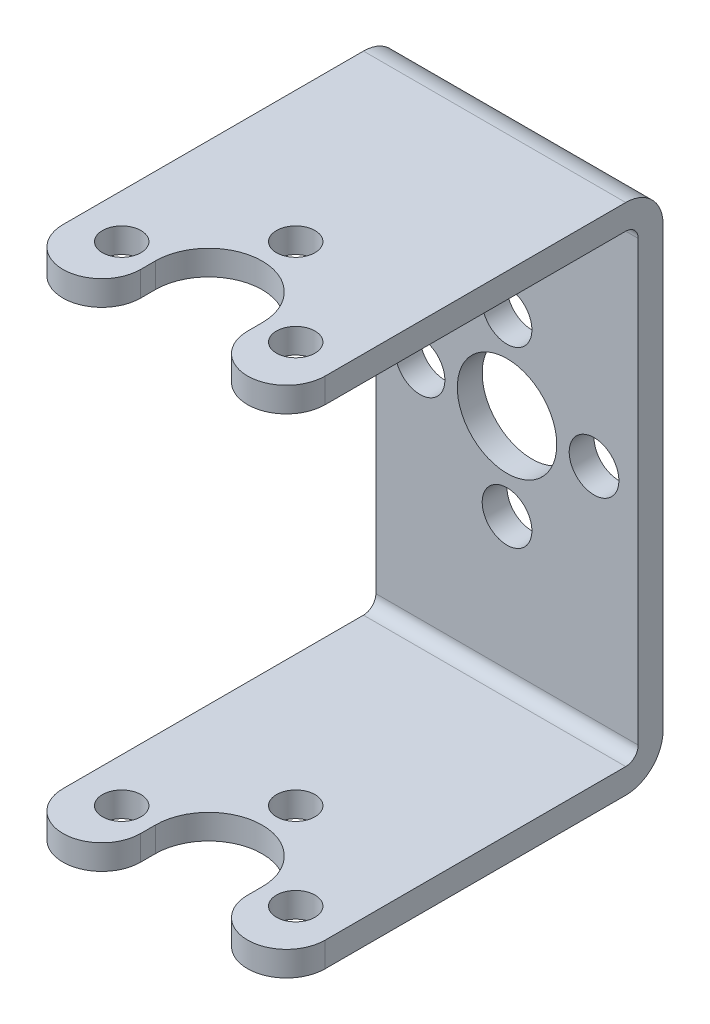
ISO-10303-21;
HEADER;
FILE_DESCRIPTION(('STEP AP214'),'2;1');
FILE_NAME('part.step','',(''),(''),'','','');
FILE_SCHEMA(('AUTOMOTIVE_DESIGN { 1 0 10303 214 1 1 1 1 }'));
ENDSEC;
DATA;
#1=APPLICATION_CONTEXT('core data for automotive mechanical design processes');
#2=APPLICATION_PROTOCOL_DEFINITION('international standard','automotive_design',2000,#1);
#3=PRODUCT_CONTEXT('',#1,'mechanical');
#4=PRODUCT('Part','Part','',(#3));
#5=PRODUCT_RELATED_PRODUCT_CATEGORY('part','',(#4));
#6=PRODUCT_DEFINITION_FORMATION('','',#4);
#7=PRODUCT_DEFINITION_CONTEXT('part definition',#1,'design');
#8=PRODUCT_DEFINITION('design','',#6,#7);
#9=PRODUCT_DEFINITION_SHAPE('','',#8);
#10=(LENGTH_UNIT() NAMED_UNIT(*) SI_UNIT(.MILLI.,.METRE.));
#11=(NAMED_UNIT(*) PLANE_ANGLE_UNIT() SI_UNIT($,.RADIAN.));
#12=(NAMED_UNIT(*) SI_UNIT($,.STERADIAN.) SOLID_ANGLE_UNIT());
#13=UNCERTAINTY_MEASURE_WITH_UNIT(LENGTH_MEASURE(1.E-05),#10,'distance_accuracy_value','');
#14=(GEOMETRIC_REPRESENTATION_CONTEXT(3) GLOBAL_UNCERTAINTY_ASSIGNED_CONTEXT((#13)) GLOBAL_UNIT_ASSIGNED_CONTEXT((#10,
#11,#12)) REPRESENTATION_CONTEXT('',''));
#15=CARTESIAN_POINT('',(0.,0.,0.));
#16=DIRECTION('',(0.,0.,1.));
#17=DIRECTION('',(1.,0.,0.));
#18=AXIS2_PLACEMENT_3D('',#15,#16,#17);
#19=CARTESIAN_POINT('',(0.,20.65,19.));
#20=DIRECTION('',(0.,1.,0.));
#21=DIRECTION('',(-1.,0.,0.));
#22=AXIS2_PLACEMENT_3D('',#19,#20,#21);
#23=CYLINDRICAL_SURFACE('',#22,1.55);
#24=CARTESIAN_POINT('',(0.,-20.65,19.));
#25=DIRECTION('',(0.,1.,0.));
#26=DIRECTION('',(-1.,0.,0.));
#27=AXIS2_PLACEMENT_3D('',#24,#25,#26);
#28=CIRCLE('',#27,1.55);
#29=CARTESIAN_POINT('',(-1.55,-20.65,19.));
#30=VERTEX_POINT('',#29);
#31=EDGE_CURVE('E285',#30,#30,#28,.T.);
#32=ORIENTED_EDGE('',*,*,#31,.F.);
#33=EDGE_LOOP('',(#32));
#34=FACE_BOUND('',#33,.T.);
#35=CARTESIAN_POINT('',(0.,-18.65,19.));
#36=DIRECTION('',(0.,1.,0.));
#37=DIRECTION('',(-1.,0.,0.));
#38=AXIS2_PLACEMENT_3D('',#35,#36,#37);
#39=CIRCLE('',#38,1.55);
#40=CARTESIAN_POINT('',(-1.55,-18.65,19.));
#41=VERTEX_POINT('',#40);
#42=EDGE_CURVE('E300',#41,#41,#39,.T.);
#43=ORIENTED_EDGE('',*,*,#42,.T.);
#44=EDGE_LOOP('',(#43));
#45=FACE_BOUND('',#44,.T.);
#46=ADVANCED_FACE('F43',(#34,#45),#23,.F.);
#47=CARTESIAN_POINT('',(7.,20.65,26.));
#48=DIRECTION('',(0.,1.,0.));
#49=DIRECTION('',(-1.,0.,0.));
#50=AXIS2_PLACEMENT_3D('',#47,#48,#49);
#51=CYLINDRICAL_SURFACE('',#50,1.55);
#52=CARTESIAN_POINT('',(7.,-20.65,26.));
#53=DIRECTION('',(0.,1.,0.));
#54=DIRECTION('',(-1.,0.,0.));
#55=AXIS2_PLACEMENT_3D('',#52,#53,#54);
#56=CIRCLE('',#55,1.55);
#57=CARTESIAN_POINT('',(5.45,-20.65,26.));
#58=VERTEX_POINT('',#57);
#59=EDGE_CURVE('E279',#58,#58,#56,.T.);
#60=ORIENTED_EDGE('',*,*,#59,.F.);
#61=EDGE_LOOP('',(#60));
#62=FACE_BOUND('',#61,.T.);
#63=CARTESIAN_POINT('',(7.,-18.65,26.));
#64=DIRECTION('',(0.,1.,0.));
#65=DIRECTION('',(-1.,0.,0.));
#66=AXIS2_PLACEMENT_3D('',#63,#64,#65);
#67=CIRCLE('',#66,1.55);
#68=CARTESIAN_POINT('',(5.45,-18.65,26.));
#69=VERTEX_POINT('',#68);
#70=EDGE_CURVE('E181',#69,#69,#67,.T.);
#71=ORIENTED_EDGE('',*,*,#70,.T.);
#72=EDGE_LOOP('',(#71));
#73=FACE_BOUND('',#72,.T.);
#74=ADVANCED_FACE('F575',(#62,#73),#51,.F.);
#75=CARTESIAN_POINT('',(-7.,20.65,26.));
#76=DIRECTION('',(0.,1.,0.));
#77=DIRECTION('',(-1.,0.,0.));
#78=AXIS2_PLACEMENT_3D('',#75,#76,#77);
#79=CYLINDRICAL_SURFACE('',#78,1.55);
#80=CARTESIAN_POINT('',(-7.,-20.65,26.));
#81=DIRECTION('',(0.,1.,0.));
#82=DIRECTION('',(-1.,0.,0.));
#83=AXIS2_PLACEMENT_3D('',#80,#81,#82);
#84=CIRCLE('',#83,1.55);
#85=CARTESIAN_POINT('',(-8.55,-20.65,26.));
#86=VERTEX_POINT('',#85);
#87=EDGE_CURVE('E273',#86,#86,#84,.T.);
#88=ORIENTED_EDGE('',*,*,#87,.F.);
#89=EDGE_LOOP('',(#88));
#90=FACE_BOUND('',#89,.T.);
#91=CARTESIAN_POINT('',(-7.,-18.65,26.));
#92=DIRECTION('',(0.,1.,0.));
#93=DIRECTION('',(-1.,0.,0.));
#94=AXIS2_PLACEMENT_3D('',#91,#92,#93);
#95=CIRCLE('',#94,1.55);
#96=CARTESIAN_POINT('',(-8.55,-18.65,26.));
#97=VERTEX_POINT('',#96);
#98=EDGE_CURVE('E176',#97,#97,#95,.T.);
#99=ORIENTED_EDGE('',*,*,#98,.T.);
#100=EDGE_LOOP('',(#99));
#101=FACE_BOUND('',#100,.T.);
#102=ADVANCED_FACE('F580',(#90,#101),#79,.F.);
#103=CARTESIAN_POINT('',(-4.3,20.65,27.175));
#104=DIRECTION('',(1.,0.,0.));
#105=DIRECTION('',(0.,1.,0.));
#106=AXIS2_PLACEMENT_3D('',#103,#104,#105);
#107=PLANE('',#106);
#108=DIRECTION('',(0.,0.,-1.));
#109=VECTOR('',#108,1.);
#110=CARTESIAN_POINT('',(-4.3,-18.65,21.9125));
#111=LINE('',#110,#109);
#112=CARTESIAN_POINT('',(-4.3,-18.65,27.175));
#113=VERTEX_POINT('',#112);
#114=CARTESIAN_POINT('',(-4.3,-18.65,26.));
#115=VERTEX_POINT('',#114);
#116=EDGE_CURVE('E114',#113,#115,#111,.T.);
#117=ORIENTED_EDGE('',*,*,#116,.F.);
#118=DIRECTION('',(0.,-1.,0.));
#119=VECTOR('',#118,1.);
#120=CARTESIAN_POINT('',(-4.3,20.65,27.175));
#121=LINE('',#120,#119);
#122=CARTESIAN_POINT('',(-4.3,-20.65,27.175));
#123=VERTEX_POINT('',#122);
#124=EDGE_CURVE('E191',#113,#123,#121,.T.);
#125=ORIENTED_EDGE('',*,*,#124,.T.);
#126=DIRECTION('',(0.,0.,-1.));
#127=VECTOR('',#126,1.);
#128=CARTESIAN_POINT('',(-4.3,-20.65,21.9125));
#129=LINE('',#128,#127);
#130=CARTESIAN_POINT('',(-4.3,-20.65,26.));
#131=VERTEX_POINT('',#130);
#132=EDGE_CURVE('E183',#123,#131,#129,.T.);
#133=ORIENTED_EDGE('',*,*,#132,.T.);
#134=DIRECTION('',(0.,-1.,0.));
#135=VECTOR('',#134,1.);
#136=CARTESIAN_POINT('',(-4.3,20.65,26.));
#137=LINE('',#136,#135);
#138=EDGE_CURVE('E11',#115,#131,#137,.T.);
#139=ORIENTED_EDGE('',*,*,#138,.F.);
#140=EDGE_LOOP('',(#117,#125,#133,#139));
#141=FACE_BOUND('',#140,.T.);
#142=ADVANCED_FACE('F595',(#141),#107,.T.);
#143=CARTESIAN_POINT('',(0.,20.65,26.));
#144=DIRECTION('',(0.,1.,0.));
#145=DIRECTION('',(-1.,0.,0.));
#146=AXIS2_PLACEMENT_3D('',#143,#144,#145);
#147=CYLINDRICAL_SURFACE('',#146,4.3);
#148=ORIENTED_EDGE('',*,*,#138,.T.);
#149=CARTESIAN_POINT('',(0.,-20.65,26.));
#150=DIRECTION('',(0.,1.,0.));
#151=DIRECTION('',(-1.,0.,0.));
#152=AXIS2_PLACEMENT_3D('',#149,#150,#151);
#153=CIRCLE('',#152,4.3);
#154=CARTESIAN_POINT('',(4.29999999995,-20.65,26.000020787284));
#155=VERTEX_POINT('',#154);
#156=EDGE_CURVE('E188',#155,#131,#153,.T.);
#157=ORIENTED_EDGE('',*,*,#156,.F.);
#158=DIRECTION('',(0.,-1.,0.));
#159=VECTOR('',#158,1.);
#160=CARTESIAN_POINT('',(4.29999999995,20.65,26.000020787284));
#161=LINE('',#160,#159);
#162=CARTESIAN_POINT('',(4.29999999995,-18.65,26.000020787284));
#163=VERTEX_POINT('',#162);
#164=EDGE_CURVE('E55',#163,#155,#161,.T.);
#165=ORIENTED_EDGE('',*,*,#164,.F.);
#166=CARTESIAN_POINT('',(0.,-18.65,26.));
#167=DIRECTION('',(0.,1.,0.));
#168=DIRECTION('',(-1.,0.,0.));
#169=AXIS2_PLACEMENT_3D('',#166,#167,#168);
#170=CIRCLE('',#169,4.3);
#171=EDGE_CURVE('E173',#163,#115,#170,.T.);
#172=ORIENTED_EDGE('',*,*,#171,.T.);
#173=EDGE_LOOP('',(#148,#157,#165,#172));
#174=FACE_BOUND('',#173,.T.);
#175=ADVANCED_FACE('F315',(#174),#147,.F.);
#176=CARTESIAN_POINT('',(4.29999999995,20.65,27.175));
#177=DIRECTION('',(1.,0.,0.));
#178=DIRECTION('',(0.,1.,0.));
#179=AXIS2_PLACEMENT_3D('',#176,#177,#178);
#180=PLANE('',#179);
#181=ORIENTED_EDGE('',*,*,#164,.T.);
#182=DIRECTION('',(0.,0.,-1.));
#183=VECTOR('',#182,1.);
#184=CARTESIAN_POINT('',(4.29999999995,-20.65,21.9125));
#185=LINE('',#184,#183);
#186=CARTESIAN_POINT('',(4.299999999975,-20.65,27.175));
#187=VERTEX_POINT('',#186);
#188=EDGE_CURVE('E270',#187,#155,#185,.T.);
#189=ORIENTED_EDGE('',*,*,#188,.F.);
#190=DIRECTION('',(0.,-1.,0.));
#191=VECTOR('',#190,1.);
#192=CARTESIAN_POINT('',(4.299999999975,20.65,27.175));
#193=LINE('',#192,#191);
#194=CARTESIAN_POINT('',(4.299999999975,-18.65,27.175));
#195=VERTEX_POINT('',#194);
#196=EDGE_CURVE('E62',#195,#187,#193,.T.);
#197=ORIENTED_EDGE('',*,*,#196,.F.);
#198=DIRECTION('',(0.,0.,-1.));
#199=VECTOR('',#198,1.);
#200=CARTESIAN_POINT('',(4.29999999995,-18.65,21.9125));
#201=LINE('',#200,#199);
#202=EDGE_CURVE('E292',#195,#163,#201,.T.);
#203=ORIENTED_EDGE('',*,*,#202,.T.);
#204=EDGE_LOOP('',(#181,#189,#197,#203));
#205=FACE_BOUND('',#204,.T.);
#206=ADVANCED_FACE('F303',(#205),#180,.F.);
#207=CARTESIAN_POINT('',(-7.,20.65,26.));
#208=DIRECTION('',(0.,1.,0.));
#209=DIRECTION('',(-1.,0.,0.));
#210=AXIS2_PLACEMENT_3D('',#207,#208,#209);
#211=CYLINDRICAL_SURFACE('',#210,1.55);
#212=CARTESIAN_POINT('',(-7.,18.65,26.));
#213=DIRECTION('',(0.,1.,0.));
#214=DIRECTION('',(-1.,0.,0.));
#215=AXIS2_PLACEMENT_3D('',#212,#213,#214);
#216=CIRCLE('',#215,1.55);
#217=CARTESIAN_POINT('',(-8.55,18.65,26.));
#218=VERTEX_POINT('',#217);
#219=EDGE_CURVE('E222',#218,#218,#216,.T.);
#220=ORIENTED_EDGE('',*,*,#219,.F.);
#221=EDGE_LOOP('',(#220));
#222=FACE_BOUND('',#221,.T.);
#223=CARTESIAN_POINT('',(-7.,20.65,26.));
#224=DIRECTION('',(0.,1.,0.));
#225=DIRECTION('',(-1.,0.,0.));
#226=AXIS2_PLACEMENT_3D('',#223,#224,#225);
#227=CIRCLE('',#226,1.55);
#228=CARTESIAN_POINT('',(-8.55,20.65,26.));
#229=VERTEX_POINT('',#228);
#230=EDGE_CURVE('E251',#229,#229,#227,.T.);
#231=ORIENTED_EDGE('',*,*,#230,.T.);
#232=EDGE_LOOP('',(#231));
#233=FACE_BOUND('',#232,.T.);
#234=ADVANCED_FACE('F607',(#222,#233),#211,.F.);
#235=CARTESIAN_POINT('',(7.,20.65,26.));
#236=DIRECTION('',(0.,1.,0.));
#237=DIRECTION('',(-1.,0.,0.));
#238=AXIS2_PLACEMENT_3D('',#235,#236,#237);
#239=CYLINDRICAL_SURFACE('',#238,1.55);
#240=CARTESIAN_POINT('',(7.,18.65,26.));
#241=DIRECTION('',(0.,1.,0.));
#242=DIRECTION('',(-1.,0.,0.));
#243=AXIS2_PLACEMENT_3D('',#240,#241,#242);
#244=CIRCLE('',#243,1.55);
#245=CARTESIAN_POINT('',(5.45,18.65,26.));
#246=VERTEX_POINT('',#245);
#247=EDGE_CURVE('E220',#246,#246,#244,.T.);
#248=ORIENTED_EDGE('',*,*,#247,.F.);
#249=EDGE_LOOP('',(#248));
#250=FACE_BOUND('',#249,.T.);
#251=CARTESIAN_POINT('',(7.,20.65,26.));
#252=DIRECTION('',(0.,1.,0.));
#253=DIRECTION('',(-1.,0.,0.));
#254=AXIS2_PLACEMENT_3D('',#251,#252,#253);
#255=CIRCLE('',#254,1.55);
#256=CARTESIAN_POINT('',(5.45,20.65,26.));
#257=VERTEX_POINT('',#256);
#258=EDGE_CURVE('E246',#257,#257,#255,.T.);
#259=ORIENTED_EDGE('',*,*,#258,.T.);
#260=EDGE_LOOP('',(#259));
#261=FACE_BOUND('',#260,.T.);
#262=ADVANCED_FACE('F606',(#250,#261),#239,.F.);
#263=CARTESIAN_POINT('',(0.,20.65,19.));
#264=DIRECTION('',(0.,1.,0.));
#265=DIRECTION('',(-1.,0.,0.));
#266=AXIS2_PLACEMENT_3D('',#263,#264,#265);
#267=CYLINDRICAL_SURFACE('',#266,1.55);
#268=CARTESIAN_POINT('',(0.,18.65,19.));
#269=DIRECTION('',(0.,1.,0.));
#270=DIRECTION('',(-1.,0.,0.));
#271=AXIS2_PLACEMENT_3D('',#268,#269,#270);
#272=CIRCLE('',#271,1.55);
#273=CARTESIAN_POINT('',(-1.55,18.65,19.));
#274=VERTEX_POINT('',#273);
#275=EDGE_CURVE('E213',#274,#274,#272,.T.);
#276=ORIENTED_EDGE('',*,*,#275,.F.);
#277=EDGE_LOOP('',(#276));
#278=FACE_BOUND('',#277,.T.);
#279=CARTESIAN_POINT('',(0.,20.65,19.));
#280=DIRECTION('',(0.,1.,0.));
#281=DIRECTION('',(-1.,0.,0.));
#282=AXIS2_PLACEMENT_3D('',#279,#280,#281);
#283=CIRCLE('',#282,1.55);
#284=CARTESIAN_POINT('',(-1.55,20.65,19.));
#285=VERTEX_POINT('',#284);
#286=EDGE_CURVE('E244',#285,#285,#283,.T.);
#287=ORIENTED_EDGE('',*,*,#286,.T.);
#288=EDGE_LOOP('',(#287));
#289=FACE_BOUND('',#288,.T.);
#290=ADVANCED_FACE('F612',(#278,#289),#267,.F.);
#291=CARTESIAN_POINT('',(-4.3,20.65,27.175));
#292=DIRECTION('',(1.,0.,0.));
#293=DIRECTION('',(0.,1.,0.));
#294=AXIS2_PLACEMENT_3D('',#291,#292,#293);
#295=PLANE('',#294);
#296=DIRECTION('',(0.,0.,-1.));
#297=VECTOR('',#296,1.);
#298=CARTESIAN_POINT('',(-4.3,20.65,27.175));
#299=LINE('',#298,#297);
#300=CARTESIAN_POINT('',(-4.3,20.65,27.175));
#301=VERTEX_POINT('',#300);
#302=CARTESIAN_POINT('',(-4.3,20.65,26.));
#303=VERTEX_POINT('',#302);
#304=EDGE_CURVE('E235',#301,#303,#299,.T.);
#305=ORIENTED_EDGE('',*,*,#304,.F.);
#306=DIRECTION('',(0.,-1.,0.));
#307=VECTOR('',#306,1.);
#308=CARTESIAN_POINT('',(-4.3,20.65,27.175));
#309=LINE('',#308,#307);
#310=CARTESIAN_POINT('',(-4.3,18.65,27.175));
#311=VERTEX_POINT('',#310);
#312=EDGE_CURVE('E223',#301,#311,#309,.T.);
#313=ORIENTED_EDGE('',*,*,#312,.T.);
#314=DIRECTION('',(0.,0.,-1.));
#315=VECTOR('',#314,1.);
#316=CARTESIAN_POINT('',(-4.3,18.65,21.9125));
#317=LINE('',#316,#315);
#318=CARTESIAN_POINT('',(-4.3,18.65,26.));
#319=VERTEX_POINT('',#318);
#320=EDGE_CURVE('E205',#311,#319,#317,.T.);
#321=ORIENTED_EDGE('',*,*,#320,.T.);
#322=DIRECTION('',(0.,-1.,0.));
#323=VECTOR('',#322,1.);
#324=CARTESIAN_POINT('',(-4.3,20.65,26.));
#325=LINE('',#324,#323);
#326=EDGE_CURVE('E202',#303,#319,#325,.T.);
#327=ORIENTED_EDGE('',*,*,#326,.F.);
#328=EDGE_LOOP('',(#305,#313,#321,#327));
#329=FACE_BOUND('',#328,.T.);
#330=ADVANCED_FACE('F619',(#329),#295,.T.);
#331=CARTESIAN_POINT('',(0.,20.65,26.));
#332=DIRECTION('',(0.,1.,0.));
#333=DIRECTION('',(-1.,0.,0.));
#334=AXIS2_PLACEMENT_3D('',#331,#332,#333);
#335=CYLINDRICAL_SURFACE('',#334,4.3);
#336=ORIENTED_EDGE('',*,*,#326,.T.);
#337=CARTESIAN_POINT('',(0.,18.65,26.));
#338=DIRECTION('',(0.,1.,0.));
#339=DIRECTION('',(-1.,0.,0.));
#340=AXIS2_PLACEMENT_3D('',#337,#338,#339);
#341=CIRCLE('',#340,4.3);
#342=CARTESIAN_POINT('',(4.29999999995,18.65,26.000020787284));
#343=VERTEX_POINT('',#342);
#344=EDGE_CURVE('E196',#343,#319,#341,.T.);
#345=ORIENTED_EDGE('',*,*,#344,.F.);
#346=DIRECTION('',(0.,-1.,0.));
#347=VECTOR('',#346,1.);
#348=CARTESIAN_POINT('',(4.29999999995,20.65,26.000020787284));
#349=LINE('',#348,#347);
#350=CARTESIAN_POINT('',(4.29999999995,20.65,26.000020787284));
#351=VERTEX_POINT('',#350);
#352=EDGE_CURVE('E180',#351,#343,#349,.T.);
#353=ORIENTED_EDGE('',*,*,#352,.F.);
#354=CARTESIAN_POINT('',(0.,20.65,26.));
#355=DIRECTION('',(0.,1.,0.));
#356=DIRECTION('',(-1.,0.,0.));
#357=AXIS2_PLACEMENT_3D('',#354,#355,#356);
#358=CIRCLE('',#357,4.3);
#359=EDGE_CURVE('E240',#351,#303,#358,.T.);
#360=ORIENTED_EDGE('',*,*,#359,.T.);
#361=EDGE_LOOP('',(#336,#345,#353,#360));
#362=FACE_BOUND('',#361,.T.);
#363=ADVANCED_FACE('F622',(#362),#335,.F.);
#364=CARTESIAN_POINT('',(4.29999999995,20.65,27.175));
#365=DIRECTION('',(1.,0.,0.));
#366=DIRECTION('',(0.,1.,0.));
#367=AXIS2_PLACEMENT_3D('',#364,#365,#366);
#368=PLANE('',#367);
#369=ORIENTED_EDGE('',*,*,#352,.T.);
#370=DIRECTION('',(0.,0.,-1.));
#371=VECTOR('',#370,1.);
#372=CARTESIAN_POINT('',(4.29999999995,18.65,21.9125));
#373=LINE('',#372,#371);
#374=CARTESIAN_POINT('',(4.299999999975,18.65,27.175));
#375=VERTEX_POINT('',#374);
#376=EDGE_CURVE('E141',#375,#343,#373,.T.);
#377=ORIENTED_EDGE('',*,*,#376,.F.);
#378=DIRECTION('',(0.,-1.,0.));
#379=VECTOR('',#378,1.);
#380=CARTESIAN_POINT('',(4.299999999975,20.65,27.175));
#381=LINE('',#380,#379);
#382=CARTESIAN_POINT('',(4.299999999975,20.65,27.175));
#383=VERTEX_POINT('',#382);
#384=EDGE_CURVE('E140',#383,#375,#381,.T.);
#385=ORIENTED_EDGE('',*,*,#384,.F.);
#386=DIRECTION('',(0.,0.,-1.));
#387=VECTOR('',#386,1.);
#388=CARTESIAN_POINT('',(4.29999999995,20.65,27.175));
#389=LINE('',#388,#387);
#390=EDGE_CURVE('E236',#383,#351,#389,.T.);
#391=ORIENTED_EDGE('',*,*,#390,.T.);
#392=EDGE_LOOP('',(#369,#377,#385,#391));
#393=FACE_BOUND('',#392,.T.);
#394=ADVANCED_FACE('F623',(#393),#368,.F.);
#395=CARTESIAN_POINT('',(7.425,20.65,27.175));
#396=DIRECTION('',(0.,1.,0.));
#397=DIRECTION('',(-1.,0.,0.));
#398=AXIS2_PLACEMENT_3D('',#395,#396,#397);
#399=CYLINDRICAL_SURFACE('',#398,3.125);
#400=ORIENTED_EDGE('',*,*,#384,.T.);
#401=CARTESIAN_POINT('',(7.425,18.65,27.175));
#402=DIRECTION('',(0.,1.,0.));
#403=DIRECTION('',(-1.,0.,0.));
#404=AXIS2_PLACEMENT_3D('',#401,#402,#403);
#405=CIRCLE('',#404,3.125);
#406=CARTESIAN_POINT('',(10.55,18.65,27.175));
#407=VERTEX_POINT('',#406);
#408=EDGE_CURVE('E131',#375,#407,#405,.T.);
#409=ORIENTED_EDGE('',*,*,#408,.T.);
#410=DIRECTION('',(0.,-1.,0.));
#411=VECTOR('',#410,1.);
#412=CARTESIAN_POINT('',(10.55,20.65,27.175));
#413=LINE('',#412,#411);
#414=CARTESIAN_POINT('',(10.55,20.65,27.175));
#415=VERTEX_POINT('',#414);
#416=EDGE_CURVE('E137',#415,#407,#413,.T.);
#417=ORIENTED_EDGE('',*,*,#416,.F.);
#418=CARTESIAN_POINT('',(7.425,20.65,27.175));
#419=DIRECTION('',(0.,1.,0.));
#420=DIRECTION('',(-1.,0.,0.));
#421=AXIS2_PLACEMENT_3D('',#418,#419,#420);
#422=CIRCLE('',#421,3.125);
#423=EDGE_CURVE('E245',#383,#415,#422,.T.);
#424=ORIENTED_EDGE('',*,*,#423,.F.);
#425=EDGE_LOOP('',(#400,#409,#417,#424));
#426=FACE_BOUND('',#425,.T.);
#427=ADVANCED_FACE('F132',(#426),#399,.T.);
#428=CARTESIAN_POINT('',(7.425,20.65,27.175));
#429=DIRECTION('',(0.,1.,0.));
#430=DIRECTION('',(-1.,0.,0.));
#431=AXIS2_PLACEMENT_3D('',#428,#429,#430);
#432=CYLINDRICAL_SURFACE('',#431,3.125);
#433=ORIENTED_EDGE('',*,*,#196,.T.);
#434=CARTESIAN_POINT('',(7.425,-20.65,27.175));
#435=DIRECTION('',(0.,1.,0.));
#436=DIRECTION('',(-1.,0.,0.));
#437=AXIS2_PLACEMENT_3D('',#434,#435,#436);
#438=CIRCLE('',#437,3.125);
#439=CARTESIAN_POINT('',(10.55,-20.65,27.175));
#440=VERTEX_POINT('',#439);
#441=EDGE_CURVE('E263',#187,#440,#438,.T.);
#442=ORIENTED_EDGE('',*,*,#441,.T.);
#443=DIRECTION('',(0.,-1.,0.));
#444=VECTOR('',#443,1.);
#445=CARTESIAN_POINT('',(10.55,20.65,27.175));
#446=LINE('',#445,#444);
#447=CARTESIAN_POINT('',(10.55,-18.65,27.175));
#448=VERTEX_POINT('',#447);
#449=EDGE_CURVE('E394',#448,#440,#446,.T.);
#450=ORIENTED_EDGE('',*,*,#449,.F.);
#451=CARTESIAN_POINT('',(7.425,-18.65,27.175));
#452=DIRECTION('',(0.,1.,0.));
#453=DIRECTION('',(-1.,0.,0.));
#454=AXIS2_PLACEMENT_3D('',#451,#452,#453);
#455=CIRCLE('',#454,3.125);
#456=EDGE_CURVE('E184',#195,#448,#455,.T.);
#457=ORIENTED_EDGE('',*,*,#456,.F.);
#458=EDGE_LOOP('',(#433,#442,#450,#457));
#459=FACE_BOUND('',#458,.T.);
#460=ADVANCED_FACE('F551',(#459),#432,.T.);
#461=CARTESIAN_POINT('',(0.,-18.65,16.65));
#462=DIRECTION('',(0.,1.,0.));
#463=DIRECTION('',(0.,0.,-1.));
#464=AXIS2_PLACEMENT_3D('',#461,#462,#463);
#465=PLANE('',#464);
#466=ORIENTED_EDGE('',*,*,#42,.F.);
#467=EDGE_LOOP('',(#466));
#468=FACE_BOUND('',#467,.T.);
#469=ORIENTED_EDGE('',*,*,#70,.F.);
#470=EDGE_LOOP('',(#469));
#471=FACE_BOUND('',#470,.T.);
#472=ORIENTED_EDGE('',*,*,#98,.F.);
#473=EDGE_LOOP('',(#472));
#474=FACE_BOUND('',#473,.T.);
#475=DIRECTION('',(1.,0.,0.));
#476=VECTOR('',#475,1.);
#477=CARTESIAN_POINT('',(-10.55,-18.65,3.));
#478=LINE('',#477,#476);
#479=CARTESIAN_POINT('',(-10.55,-18.65,3.));
#480=VERTEX_POINT('',#479);
#481=CARTESIAN_POINT('',(10.55,-18.65,3.));
#482=VERTEX_POINT('',#481);
#483=EDGE_CURVE('E381',#480,#482,#478,.T.);
#484=ORIENTED_EDGE('',*,*,#483,.F.);
#485=DIRECTION('',(0.,0.,1.));
#486=VECTOR('',#485,1.);
#487=CARTESIAN_POINT('',(-10.55,-18.65,3.));
#488=LINE('',#487,#486);
#489=CARTESIAN_POINT('',(-10.55,-18.65,27.175));
#490=VERTEX_POINT('',#489);
#491=EDGE_CURVE('E376',#480,#490,#488,.T.);
#492=ORIENTED_EDGE('',*,*,#491,.T.);
#493=CARTESIAN_POINT('',(-7.425,-18.65,27.175));
#494=DIRECTION('',(0.,1.,0.));
#495=DIRECTION('',(-1.,0.,0.));
#496=AXIS2_PLACEMENT_3D('',#493,#494,#495);
#497=CIRCLE('',#496,3.125);
#498=EDGE_CURVE('E174',#490,#113,#497,.T.);
#499=ORIENTED_EDGE('',*,*,#498,.T.);
#500=ORIENTED_EDGE('',*,*,#116,.T.);
#501=ORIENTED_EDGE('',*,*,#171,.F.);
#502=ORIENTED_EDGE('',*,*,#202,.F.);
#503=ORIENTED_EDGE('',*,*,#456,.T.);
#504=DIRECTION('',(0.,0.,-1.));
#505=VECTOR('',#504,1.);
#506=CARTESIAN_POINT('',(10.55,-18.65,30.3));
#507=LINE('',#506,#505);
#508=EDGE_CURVE('E393',#448,#482,#507,.T.);
#509=ORIENTED_EDGE('',*,*,#508,.T.);
#510=EDGE_LOOP('',(#484,#492,#499,#500,#501,#502,#503,#509));
#511=FACE_BOUND('',#510,.T.);
#512=ADVANCED_FACE('F552',(#468,#471,#474,#511),#465,.T.);
#513=CARTESIAN_POINT('',(-7.425,20.65,27.175));
#514=DIRECTION('',(0.,1.,0.));
#515=DIRECTION('',(-1.,0.,0.));
#516=AXIS2_PLACEMENT_3D('',#513,#514,#515);
#517=CYLINDRICAL_SURFACE('',#516,3.125);
#518=CARTESIAN_POINT('',(-7.425,-20.65,27.175));
#519=DIRECTION('',(0.,1.,0.));
#520=DIRECTION('',(-1.,0.,0.));
#521=AXIS2_PLACEMENT_3D('',#518,#519,#520);
#522=CIRCLE('',#521,3.125);
#523=CARTESIAN_POINT('',(-10.55,-20.65,27.175));
#524=VERTEX_POINT('',#523);
#525=EDGE_CURVE('E187',#524,#123,#522,.T.);
#526=ORIENTED_EDGE('',*,*,#525,.T.);
#527=ORIENTED_EDGE('',*,*,#124,.F.);
#528=ORIENTED_EDGE('',*,*,#498,.F.);
#529=DIRECTION('',(0.,-1.,0.));
#530=VECTOR('',#529,1.);
#531=CARTESIAN_POINT('',(-10.55,20.65,27.175));
#532=LINE('',#531,#530);
#533=EDGE_CURVE('E375',#490,#524,#532,.T.);
#534=ORIENTED_EDGE('',*,*,#533,.T.);
#535=EDGE_LOOP('',(#526,#527,#528,#534));
#536=FACE_BOUND('',#535,.T.);
#537=ADVANCED_FACE('F566',(#536),#517,.T.);
#538=CARTESIAN_POINT('',(0.,-20.65,16.65));
#539=DIRECTION('',(0.,1.,0.));
#540=DIRECTION('',(0.,0.,-1.));
#541=AXIS2_PLACEMENT_3D('',#538,#539,#540);
#542=PLANE('',#541);
#543=ORIENTED_EDGE('',*,*,#31,.T.);
#544=EDGE_LOOP('',(#543));
#545=FACE_BOUND('',#544,.T.);
#546=ORIENTED_EDGE('',*,*,#59,.T.);
#547=EDGE_LOOP('',(#546));
#548=FACE_BOUND('',#547,.T.);
#549=ORIENTED_EDGE('',*,*,#87,.T.);
#550=EDGE_LOOP('',(#549));
#551=FACE_BOUND('',#550,.T.);
#552=ORIENTED_EDGE('',*,*,#441,.F.);
#553=ORIENTED_EDGE('',*,*,#188,.T.);
#554=ORIENTED_EDGE('',*,*,#156,.T.);
#555=ORIENTED_EDGE('',*,*,#132,.F.);
#556=ORIENTED_EDGE('',*,*,#525,.F.);
#557=DIRECTION('',(0.,0.,1.));
#558=VECTOR('',#557,1.);
#559=CARTESIAN_POINT('',(-10.55,-20.65,3.));
#560=LINE('',#559,#558);
#561=CARTESIAN_POINT('',(-10.55,-20.65,3.));
#562=VERTEX_POINT('',#561);
#563=EDGE_CURVE('E364',#562,#524,#560,.T.);
#564=ORIENTED_EDGE('',*,*,#563,.F.);
#565=DIRECTION('',(-1.,0.,0.));
#566=VECTOR('',#565,1.);
#567=CARTESIAN_POINT('',(10.55,-20.65,3.));
#568=LINE('',#567,#566);
#569=CARTESIAN_POINT('',(10.55,-20.65,3.));
#570=VERTEX_POINT('',#569);
#571=EDGE_CURVE('E259',#570,#562,#568,.T.);
#572=ORIENTED_EDGE('',*,*,#571,.F.);
#573=DIRECTION('',(0.,0.,-1.));
#574=VECTOR('',#573,1.);
#575=CARTESIAN_POINT('',(10.55,-20.65,30.3));
#576=LINE('',#575,#574);
#577=EDGE_CURVE('E332',#440,#570,#576,.T.);
#578=ORIENTED_EDGE('',*,*,#577,.F.);
#579=EDGE_LOOP('',(#552,#553,#554,#555,#556,#564,#572,#578));
#580=FACE_BOUND('',#579,.T.);
#581=ADVANCED_FACE('F316',(#545,#548,#551,#580),#542,.F.);
#582=CARTESIAN_POINT('',(10.55,-17.65,3.));
#583=DIRECTION('',(-1.,0.,0.));
#584=DIRECTION('',(0.,0.,-1.));
#585=AXIS2_PLACEMENT_3D('',#582,#583,#584);
#586=CYLINDRICAL_SURFACE('',#585,3.);
#587=CARTESIAN_POINT('',(10.55,-17.65,3.));
#588=DIRECTION('',(-1.,0.,0.));
#589=DIRECTION('',(0.,0.,-1.));
#590=AXIS2_PLACEMENT_3D('',#587,#588,#589);
#591=CIRCLE('',#590,3.);
#592=CARTESIAN_POINT('',(10.55,-17.65,0.));
#593=VERTEX_POINT('',#592);
#594=EDGE_CURVE('E330',#593,#570,#591,.T.);
#595=ORIENTED_EDGE('',*,*,#594,.T.);
#596=ORIENTED_EDGE('',*,*,#571,.T.);
#597=CARTESIAN_POINT('',(-10.55,-17.65,3.));
#598=DIRECTION('',(-1.,0.,0.));
#599=DIRECTION('',(0.,0.,-1.));
#600=AXIS2_PLACEMENT_3D('',#597,#598,#599);
#601=CIRCLE('',#600,3.);
#602=CARTESIAN_POINT('',(-10.55,-17.65,0.));
#603=VERTEX_POINT('',#602);
#604=EDGE_CURVE('E363',#603,#562,#601,.T.);
#605=ORIENTED_EDGE('',*,*,#604,.F.);
#606=DIRECTION('',(1.,0.,0.));
#607=VECTOR('',#606,1.);
#608=CARTESIAN_POINT('',(-10.55,-17.65,0.));
#609=LINE('',#608,#607);
#610=EDGE_CURVE('E256',#603,#593,#609,.T.);
#611=ORIENTED_EDGE('',*,*,#610,.T.);
#612=EDGE_LOOP('',(#595,#596,#605,#611));
#613=FACE_BOUND('',#612,.T.);
#614=ADVANCED_FACE('F556',(#613),#586,.T.);
#615=CARTESIAN_POINT('',(-10.55,-17.65,0.));
#616=DIRECTION('',(0.,0.,1.));
#617=DIRECTION('',(1.,0.,0.));
#618=AXIS2_PLACEMENT_3D('',#615,#616,#617);
#619=PLANE('',#618);
#620=CARTESIAN_POINT('',(0.,-7.,0.));
#621=DIRECTION('',(0.,0.,-1.));
#622=DIRECTION('',(-1.,0.,0.));
#623=AXIS2_PLACEMENT_3D('',#620,#621,#622);
#624=CIRCLE('',#623,2.);
#625=CARTESIAN_POINT('',(-2.,-7.,0.));
#626=VERTEX_POINT('',#625);
#627=EDGE_CURVE('E534',#626,#626,#624,.T.);
#628=ORIENTED_EDGE('',*,*,#627,.F.);
#629=EDGE_LOOP('',(#628));
#630=FACE_BOUND('',#629,.T.);
#631=CARTESIAN_POINT('',(7.,0.,0.));
#632=DIRECTION('',(0.,0.,-1.));
#633=DIRECTION('',(-1.,0.,0.));
#634=AXIS2_PLACEMENT_3D('',#631,#632,#633);
#635=CIRCLE('',#634,2.);
#636=CARTESIAN_POINT('',(5.,0.,0.));
#637=VERTEX_POINT('',#636);
#638=EDGE_CURVE('E918',#637,#637,#635,.T.);
#639=ORIENTED_EDGE('',*,*,#638,.F.);
#640=EDGE_LOOP('',(#639));
#641=FACE_BOUND('',#640,.T.);
#642=CARTESIAN_POINT('',(0.,7.,0.));
#643=DIRECTION('',(0.,0.,-1.));
#644=DIRECTION('',(-1.,0.,0.));
#645=AXIS2_PLACEMENT_3D('',#642,#643,#644);
#646=CIRCLE('',#645,2.);
#647=CARTESIAN_POINT('',(-2.00000000000005,7.,0.));
#648=VERTEX_POINT('',#647);
#649=EDGE_CURVE('E922',#648,#648,#646,.T.);
#650=ORIENTED_EDGE('',*,*,#649,.F.);
#651=EDGE_LOOP('',(#650));
#652=FACE_BOUND('',#651,.T.);
#653=CARTESIAN_POINT('',(-7.,0.,0.));
#654=DIRECTION('',(0.,0.,-1.));
#655=DIRECTION('',(-1.,0.,0.));
#656=AXIS2_PLACEMENT_3D('',#653,#654,#655);
#657=CIRCLE('',#656,2.);
#658=CARTESIAN_POINT('',(-9.,0.,0.));
#659=VERTEX_POINT('',#658);
#660=EDGE_CURVE('E929',#659,#659,#657,.T.);
#661=ORIENTED_EDGE('',*,*,#660,.F.);
#662=EDGE_LOOP('',(#661));
#663=FACE_BOUND('',#662,.T.);
#664=CARTESIAN_POINT('',(0.,0.,0.));
#665=DIRECTION('',(0.,0.,1.));
#666=DIRECTION('',(1.,0.,0.));
#667=AXIS2_PLACEMENT_3D('',#664,#665,#666);
#668=CIRCLE('',#667,4.);
#669=CARTESIAN_POINT('',(4.,0.,0.));
#670=VERTEX_POINT('',#669);
#671=EDGE_CURVE('E145',#670,#670,#668,.T.);
#672=ORIENTED_EDGE('',*,*,#671,.T.);
#673=EDGE_LOOP('',(#672));
#674=FACE_BOUND('',#673,.T.);
#675=DIRECTION('',(1.,0.,0.));
#676=VECTOR('',#675,1.);
#677=CARTESIAN_POINT('',(-10.55,17.65,0.));
#678=LINE('',#677,#676);
#679=CARTESIAN_POINT('',(-10.55,17.65,0.));
#680=VERTEX_POINT('',#679);
#681=CARTESIAN_POINT('',(10.55,17.65,0.));
#682=VERTEX_POINT('',#681);
#683=EDGE_CURVE('E255',#680,#682,#678,.T.);
#684=ORIENTED_EDGE('',*,*,#683,.T.);
#685=DIRECTION('',(0.,1.,0.));
#686=VECTOR('',#685,1.);
#687=CARTESIAN_POINT('',(10.55,-17.65,0.));
#688=LINE('',#687,#686);
#689=EDGE_CURVE('E329',#593,#682,#688,.T.);
#690=ORIENTED_EDGE('',*,*,#689,.F.);
#691=ORIENTED_EDGE('',*,*,#610,.F.);
#692=DIRECTION('',(0.,1.,0.));
#693=VECTOR('',#692,1.);
#694=CARTESIAN_POINT('',(-10.55,-17.65,0.));
#695=LINE('',#694,#693);
#696=EDGE_CURVE('E359',#603,#680,#695,.T.);
#697=ORIENTED_EDGE('',*,*,#696,.T.);
#698=EDGE_LOOP('',(#684,#690,#691,#697));
#699=FACE_BOUND('',#698,.T.);
#700=ADVANCED_FACE('F557',(#630,#641,#652,#663,#674,#699),#619,.F.);
#701=CARTESIAN_POINT('',(10.55,17.65,3.));
#702=DIRECTION('',(-1.,0.,0.));
#703=DIRECTION('',(0.,0.,-1.));
#704=AXIS2_PLACEMENT_3D('',#701,#702,#703);
#705=CYLINDRICAL_SURFACE('',#704,3.);
#706=ORIENTED_EDGE('',*,*,#683,.F.);
#707=CARTESIAN_POINT('',(-10.55,17.65,3.));
#708=DIRECTION('',(1.,0.,0.));
#709=DIRECTION('',(0.,0.,-1.));
#710=AXIS2_PLACEMENT_3D('',#707,#708,#709);
#711=CIRCLE('',#710,3.);
#712=CARTESIAN_POINT('',(-10.55,20.65,3.));
#713=VERTEX_POINT('',#712);
#714=EDGE_CURVE('E351',#680,#713,#711,.T.);
#715=ORIENTED_EDGE('',*,*,#714,.T.);
#716=DIRECTION('',(-1.,0.,0.));
#717=VECTOR('',#716,1.);
#718=CARTESIAN_POINT('',(10.55,20.65,3.));
#719=LINE('',#718,#717);
#720=CARTESIAN_POINT('',(10.55,20.65,3.));
#721=VERTEX_POINT('',#720);
#722=EDGE_CURVE('E228',#721,#713,#719,.T.);
#723=ORIENTED_EDGE('',*,*,#722,.F.);
#724=CARTESIAN_POINT('',(10.55,17.65,3.));
#725=DIRECTION('',(1.,0.,0.));
#726=DIRECTION('',(0.,0.,-1.));
#727=AXIS2_PLACEMENT_3D('',#724,#725,#726);
#728=CIRCLE('',#727,3.);
#729=EDGE_CURVE('E169',#682,#721,#728,.T.);
#730=ORIENTED_EDGE('',*,*,#729,.F.);
#731=EDGE_LOOP('',(#706,#715,#723,#730));
#732=FACE_BOUND('',#731,.T.);
#733=ADVANCED_FACE('F416',(#732),#705,.T.);
#734=CARTESIAN_POINT('',(0.,20.65,16.65));
#735=DIRECTION('',(0.,1.,0.));
#736=DIRECTION('',(0.,0.,-1.));
#737=AXIS2_PLACEMENT_3D('',#734,#735,#736);
#738=PLANE('',#737);
#739=ORIENTED_EDGE('',*,*,#230,.F.);
#740=EDGE_LOOP('',(#739));
#741=FACE_BOUND('',#740,.T.);
#742=ORIENTED_EDGE('',*,*,#258,.F.);
#743=EDGE_LOOP('',(#742));
#744=FACE_BOUND('',#743,.T.);
#745=ORIENTED_EDGE('',*,*,#286,.F.);
#746=EDGE_LOOP('',(#745));
#747=FACE_BOUND('',#746,.T.);
#748=DIRECTION('',(0.,0.,-1.));
#749=VECTOR('',#748,1.);
#750=CARTESIAN_POINT('',(10.55,20.65,30.3));
#751=LINE('',#750,#749);
#752=EDGE_CURVE('E162',#415,#721,#751,.T.);
#753=ORIENTED_EDGE('',*,*,#752,.T.);
#754=ORIENTED_EDGE('',*,*,#722,.T.);
#755=DIRECTION('',(0.,0.,1.));
#756=VECTOR('',#755,1.);
#757=CARTESIAN_POINT('',(-10.55,20.65,3.));
#758=LINE('',#757,#756);
#759=CARTESIAN_POINT('',(-10.55,20.65,27.175));
#760=VERTEX_POINT('',#759);
#761=EDGE_CURVE('E350',#713,#760,#758,.T.);
#762=ORIENTED_EDGE('',*,*,#761,.T.);
#763=CARTESIAN_POINT('',(-7.425,20.65,27.175));
#764=DIRECTION('',(0.,1.,0.));
#765=DIRECTION('',(-1.,0.,0.));
#766=AXIS2_PLACEMENT_3D('',#763,#764,#765);
#767=CIRCLE('',#766,3.125);
#768=EDGE_CURVE('E227',#760,#301,#767,.T.);
#769=ORIENTED_EDGE('',*,*,#768,.T.);
#770=ORIENTED_EDGE('',*,*,#304,.T.);
#771=ORIENTED_EDGE('',*,*,#359,.F.);
#772=ORIENTED_EDGE('',*,*,#390,.F.);
#773=ORIENTED_EDGE('',*,*,#423,.T.);
#774=EDGE_LOOP('',(#753,#754,#762,#769,#770,#771,#772,#773));
#775=FACE_BOUND('',#774,.T.);
#776=ADVANCED_FACE('F642',(#741,#744,#747,#775),#738,.T.);
#777=CARTESIAN_POINT('',(-7.425,20.65,27.175));
#778=DIRECTION('',(0.,1.,0.));
#779=DIRECTION('',(-1.,0.,0.));
#780=AXIS2_PLACEMENT_3D('',#777,#778,#779);
#781=CYLINDRICAL_SURFACE('',#780,3.125);
#782=CARTESIAN_POINT('',(-7.425,18.65,27.175));
#783=DIRECTION('',(0.,1.,0.));
#784=DIRECTION('',(-1.,0.,0.));
#785=AXIS2_PLACEMENT_3D('',#782,#783,#784);
#786=CIRCLE('',#785,3.125);
#787=CARTESIAN_POINT('',(-10.55,18.65,27.175));
#788=VERTEX_POINT('',#787);
#789=EDGE_CURVE('E207',#788,#311,#786,.T.);
#790=ORIENTED_EDGE('',*,*,#789,.T.);
#791=ORIENTED_EDGE('',*,*,#312,.F.);
#792=ORIENTED_EDGE('',*,*,#768,.F.);
#793=DIRECTION('',(0.,-1.,0.));
#794=VECTOR('',#793,1.);
#795=CARTESIAN_POINT('',(-10.55,20.65,27.175));
#796=LINE('',#795,#794);
#797=EDGE_CURVE('E324',#760,#788,#796,.T.);
#798=ORIENTED_EDGE('',*,*,#797,.T.);
#799=EDGE_LOOP('',(#790,#791,#792,#798));
#800=FACE_BOUND('',#799,.T.);
#801=ADVANCED_FACE('F654',(#800),#781,.T.);
#802=CARTESIAN_POINT('',(0.,18.65,16.65));
#803=DIRECTION('',(0.,1.,0.));
#804=DIRECTION('',(0.,0.,-1.));
#805=AXIS2_PLACEMENT_3D('',#802,#803,#804);
#806=PLANE('',#805);
#807=ORIENTED_EDGE('',*,*,#219,.T.);
#808=EDGE_LOOP('',(#807));
#809=FACE_BOUND('',#808,.T.);
#810=ORIENTED_EDGE('',*,*,#247,.T.);
#811=EDGE_LOOP('',(#810));
#812=FACE_BOUND('',#811,.T.);
#813=ORIENTED_EDGE('',*,*,#275,.T.);
#814=EDGE_LOOP('',(#813));
#815=FACE_BOUND('',#814,.T.);
#816=DIRECTION('',(0.,0.,-1.));
#817=VECTOR('',#816,1.);
#818=CARTESIAN_POINT('',(10.55,18.65,30.3));
#819=LINE('',#818,#817);
#820=CARTESIAN_POINT('',(10.55,18.65,3.));
#821=VERTEX_POINT('',#820);
#822=EDGE_CURVE('E146',#407,#821,#819,.T.);
#823=ORIENTED_EDGE('',*,*,#822,.F.);
#824=ORIENTED_EDGE('',*,*,#408,.F.);
#825=ORIENTED_EDGE('',*,*,#376,.T.);
#826=ORIENTED_EDGE('',*,*,#344,.T.);
#827=ORIENTED_EDGE('',*,*,#320,.F.);
#828=ORIENTED_EDGE('',*,*,#789,.F.);
#829=DIRECTION('',(0.,0.,1.));
#830=VECTOR('',#829,1.);
#831=CARTESIAN_POINT('',(-10.55,18.65,3.));
#832=LINE('',#831,#830);
#833=CARTESIAN_POINT('',(-10.55,18.65,3.));
#834=VERTEX_POINT('',#833);
#835=EDGE_CURVE('E345',#834,#788,#832,.T.);
#836=ORIENTED_EDGE('',*,*,#835,.F.);
#837=DIRECTION('',(1.,0.,0.));
#838=VECTOR('',#837,1.);
#839=CARTESIAN_POINT('',(-10.55,18.65,3.));
#840=LINE('',#839,#838);
#841=EDGE_CURVE('E153',#834,#821,#840,.T.);
#842=ORIENTED_EDGE('',*,*,#841,.T.);
#843=EDGE_LOOP('',(#823,#824,#825,#826,#827,#828,#836,#842));
#844=FACE_BOUND('',#843,.T.);
#845=ADVANCED_FACE('F149',(#809,#812,#815,#844),#806,.F.);
#846=CARTESIAN_POINT('',(0.,0.,0.));
#847=DIRECTION('',(0.,0.,-1.));
#848=DIRECTION('',(1.,0.,0.));
#849=AXIS2_PLACEMENT_3D('',#846,#847,#848);
#850=CYLINDRICAL_SURFACE('',#849,4.);
#851=CARTESIAN_POINT('',(0.,0.,2.));
#852=DIRECTION('',(0.,0.,-1.));
#853=DIRECTION('',(1.,0.,0.));
#854=AXIS2_PLACEMENT_3D('',#851,#852,#853);
#855=CIRCLE('',#854,4.);
#856=CARTESIAN_POINT('',(4.,0.,2.));
#857=VERTEX_POINT('',#856);
#858=EDGE_CURVE('E335',#857,#857,#855,.T.);
#859=ORIENTED_EDGE('',*,*,#858,.F.);
#860=EDGE_LOOP('',(#859));
#861=FACE_BOUND('',#860,.T.);
#862=ORIENTED_EDGE('',*,*,#671,.F.);
#863=EDGE_LOOP('',(#862));
#864=FACE_BOUND('',#863,.T.);
#865=ADVANCED_FACE('F663',(#861,#864),#850,.F.);
#866=CARTESIAN_POINT('',(10.55,0.,9.014711516048));
#867=DIRECTION('',(1.,0.,0.));
#868=DIRECTION('',(0.,1.,0.));
#869=AXIS2_PLACEMENT_3D('',#866,#867,#868);
#870=PLANE('',#869);
#871=DIRECTION('',(0.,1.,0.));
#872=VECTOR('',#871,1.);
#873=CARTESIAN_POINT('',(10.55,-17.65,2.));
#874=LINE('',#873,#872);
#875=CARTESIAN_POINT('',(10.55,-17.65,2.));
#876=VERTEX_POINT('',#875);
#877=CARTESIAN_POINT('',(10.55,17.65,2.));
#878=VERTEX_POINT('',#877);
#879=EDGE_CURVE('E524',#876,#878,#874,.T.);
#880=ORIENTED_EDGE('',*,*,#879,.F.);
#881=CARTESIAN_POINT('',(10.55,-17.65,3.));
#882=DIRECTION('',(-1.,0.,0.));
#883=DIRECTION('',(0.,0.,-1.));
#884=AXIS2_PLACEMENT_3D('',#881,#882,#883);
#885=CIRCLE('',#884,1.);
#886=EDGE_CURVE('E384',#876,#482,#885,.T.);
#887=ORIENTED_EDGE('',*,*,#886,.T.);
#888=ORIENTED_EDGE('',*,*,#508,.F.);
#889=ORIENTED_EDGE('',*,*,#449,.T.);
#890=ORIENTED_EDGE('',*,*,#577,.T.);
#891=ORIENTED_EDGE('',*,*,#594,.F.);
#892=ORIENTED_EDGE('',*,*,#689,.T.);
#893=ORIENTED_EDGE('',*,*,#729,.T.);
#894=ORIENTED_EDGE('',*,*,#752,.F.);
#895=ORIENTED_EDGE('',*,*,#416,.T.);
#896=ORIENTED_EDGE('',*,*,#822,.T.);
#897=CARTESIAN_POINT('',(10.55,17.65,3.));
#898=DIRECTION('',(1.,0.,0.));
#899=DIRECTION('',(0.,0.,-1.));
#900=AXIS2_PLACEMENT_3D('',#897,#898,#899);
#901=CIRCLE('',#900,1.);
#902=EDGE_CURVE('E386',#878,#821,#901,.T.);
#903=ORIENTED_EDGE('',*,*,#902,.F.);
#904=EDGE_LOOP('',(#880,#887,#888,#889,#890,#891,#892,#893,#894,#895,#896,#903));
#905=FACE_BOUND('',#904,.T.);
#906=ADVANCED_FACE('F159',(#905),#870,.T.);
#907=CARTESIAN_POINT('',(-10.55,17.65,3.));
#908=DIRECTION('',(1.,0.,0.));
#909=DIRECTION('',(0.,0.,-1.));
#910=AXIS2_PLACEMENT_3D('',#907,#908,#909);
#911=CYLINDRICAL_SURFACE('',#910,1.);
#912=DIRECTION('',(1.,0.,0.));
#913=VECTOR('',#912,1.);
#914=CARTESIAN_POINT('',(-10.55,17.65,2.));
#915=LINE('',#914,#913);
#916=CARTESIAN_POINT('',(-10.55,17.65,2.));
#917=VERTEX_POINT('',#916);
#918=EDGE_CURVE('E340',#917,#878,#915,.T.);
#919=ORIENTED_EDGE('',*,*,#918,.T.);
#920=ORIENTED_EDGE('',*,*,#902,.T.);
#921=ORIENTED_EDGE('',*,*,#841,.F.);
#922=CARTESIAN_POINT('',(-10.55,17.65,3.));
#923=DIRECTION('',(1.,0.,0.));
#924=DIRECTION('',(0.,0.,-1.));
#925=AXIS2_PLACEMENT_3D('',#922,#923,#924);
#926=CIRCLE('',#925,1.);
#927=EDGE_CURVE('E336',#917,#834,#926,.T.);
#928=ORIENTED_EDGE('',*,*,#927,.F.);
#929=EDGE_LOOP('',(#919,#920,#921,#928));
#930=FACE_BOUND('',#929,.T.);
#931=ADVANCED_FACE('F547',(#930),#911,.F.);
#932=CARTESIAN_POINT('',(-10.55,-17.65,3.));
#933=DIRECTION('',(1.,0.,0.));
#934=DIRECTION('',(0.,0.,-1.));
#935=AXIS2_PLACEMENT_3D('',#932,#933,#934);
#936=CYLINDRICAL_SURFACE('',#935,1.);
#937=CARTESIAN_POINT('',(-10.55,-17.65,3.));
#938=DIRECTION('',(-1.,0.,0.));
#939=DIRECTION('',(0.,0.,-1.));
#940=AXIS2_PLACEMENT_3D('',#937,#938,#939);
#941=CIRCLE('',#940,1.);
#942=CARTESIAN_POINT('',(-10.55,-17.65,2.));
#943=VERTEX_POINT('',#942);
#944=EDGE_CURVE('E380',#943,#480,#941,.T.);
#945=ORIENTED_EDGE('',*,*,#944,.T.);
#946=ORIENTED_EDGE('',*,*,#483,.T.);
#947=ORIENTED_EDGE('',*,*,#886,.F.);
#948=DIRECTION('',(1.,0.,0.));
#949=VECTOR('',#948,1.);
#950=CARTESIAN_POINT('',(-10.55,-17.65,2.));
#951=LINE('',#950,#949);
#952=EDGE_CURVE('E520',#943,#876,#951,.T.);
#953=ORIENTED_EDGE('',*,*,#952,.F.);
#954=EDGE_LOOP('',(#945,#946,#947,#953));
#955=FACE_BOUND('',#954,.T.);
#956=ADVANCED_FACE('F517',(#955),#936,.F.);
#957=CARTESIAN_POINT('',(-10.55,0.,9.014711516048));
#958=DIRECTION('',(-1.,0.,0.));
#959=DIRECTION('',(0.,0.,1.));
#960=AXIS2_PLACEMENT_3D('',#957,#958,#959);
#961=PLANE('',#960);
#962=DIRECTION('',(0.,1.,0.));
#963=VECTOR('',#962,1.);
#964=CARTESIAN_POINT('',(-10.55,-17.65,2.));
#965=LINE('',#964,#963);
#966=EDGE_CURVE('E515',#943,#917,#965,.T.);
#967=ORIENTED_EDGE('',*,*,#966,.T.);
#968=ORIENTED_EDGE('',*,*,#927,.T.);
#969=ORIENTED_EDGE('',*,*,#835,.T.);
#970=ORIENTED_EDGE('',*,*,#797,.F.);
#971=ORIENTED_EDGE('',*,*,#761,.F.);
#972=ORIENTED_EDGE('',*,*,#714,.F.);
#973=ORIENTED_EDGE('',*,*,#696,.F.);
#974=ORIENTED_EDGE('',*,*,#604,.T.);
#975=ORIENTED_EDGE('',*,*,#563,.T.);
#976=ORIENTED_EDGE('',*,*,#533,.F.);
#977=ORIENTED_EDGE('',*,*,#491,.F.);
#978=ORIENTED_EDGE('',*,*,#944,.F.);
#979=EDGE_LOOP('',(#967,#968,#969,#970,#971,#972,#973,#974,#975,#976,#977,#978));
#980=FACE_BOUND('',#979,.T.);
#981=ADVANCED_FACE('F506',(#980),#961,.T.);
#982=CARTESIAN_POINT('',(-10.55,-17.65,2.));
#983=DIRECTION('',(0.,0.,1.));
#984=DIRECTION('',(1.,0.,0.));
#985=AXIS2_PLACEMENT_3D('',#982,#983,#984);
#986=PLANE('',#985);
#987=CARTESIAN_POINT('',(0.,-7.,2.));
#988=DIRECTION('',(0.,0.,-1.));
#989=DIRECTION('',(-1.,0.,0.));
#990=AXIS2_PLACEMENT_3D('',#987,#988,#989);
#991=CIRCLE('',#990,2.);
#992=CARTESIAN_POINT('',(-2.,-7.,2.));
#993=VERTEX_POINT('',#992);
#994=EDGE_CURVE('E526',#993,#993,#991,.T.);
#995=ORIENTED_EDGE('',*,*,#994,.T.);
#996=EDGE_LOOP('',(#995));
#997=FACE_BOUND('',#996,.T.);
#998=CARTESIAN_POINT('',(7.,0.,2.));
#999=DIRECTION('',(0.,0.,-1.));
#1000=DIRECTION('',(-1.,0.,0.));
#1001=AXIS2_PLACEMENT_3D('',#998,#999,#1000);
#1002=CIRCLE('',#1001,2.);
#1003=CARTESIAN_POINT('',(5.,0.,2.));
#1004=VERTEX_POINT('',#1003);
#1005=EDGE_CURVE('E919',#1004,#1004,#1002,.T.);
#1006=ORIENTED_EDGE('',*,*,#1005,.T.);
#1007=EDGE_LOOP('',(#1006));
#1008=FACE_BOUND('',#1007,.T.);
#1009=CARTESIAN_POINT('',(0.,7.,2.));
#1010=DIRECTION('',(0.,0.,-1.));
#1011=DIRECTION('',(-1.,0.,0.));
#1012=AXIS2_PLACEMENT_3D('',#1009,#1010,#1011);
#1013=CIRCLE('',#1012,2.);
#1014=CARTESIAN_POINT('',(-2.00000000000005,7.,2.));
#1015=VERTEX_POINT('',#1014);
#1016=EDGE_CURVE('E930',#1015,#1015,#1013,.T.);
#1017=ORIENTED_EDGE('',*,*,#1016,.T.);
#1018=EDGE_LOOP('',(#1017));
#1019=FACE_BOUND('',#1018,.T.);
#1020=CARTESIAN_POINT('',(-7.,0.,2.));
#1021=DIRECTION('',(0.,0.,-1.));
#1022=DIRECTION('',(-1.,0.,0.));
#1023=AXIS2_PLACEMENT_3D('',#1020,#1021,#1022);
#1024=CIRCLE('',#1023,2.);
#1025=CARTESIAN_POINT('',(-9.,0.,2.));
#1026=VERTEX_POINT('',#1025);
#1027=EDGE_CURVE('E935',#1026,#1026,#1024,.T.);
#1028=ORIENTED_EDGE('',*,*,#1027,.T.);
#1029=EDGE_LOOP('',(#1028));
#1030=FACE_BOUND('',#1029,.T.);
#1031=ORIENTED_EDGE('',*,*,#858,.T.);
#1032=EDGE_LOOP('',(#1031));
#1033=FACE_BOUND('',#1032,.T.);
#1034=ORIENTED_EDGE('',*,*,#966,.F.);
#1035=ORIENTED_EDGE('',*,*,#952,.T.);
#1036=ORIENTED_EDGE('',*,*,#879,.T.);
#1037=ORIENTED_EDGE('',*,*,#918,.F.);
#1038=EDGE_LOOP('',(#1034,#1035,#1036,#1037));
#1039=FACE_BOUND('',#1038,.T.);
#1040=ADVANCED_FACE('F523',(#997,#1008,#1019,#1030,#1033,#1039),#986,.T.);
#1041=CARTESIAN_POINT('',(-7.,0.,2.));
#1042=DIRECTION('',(0.,0.,-1.));
#1043=DIRECTION('',(-1.,0.,0.));
#1044=AXIS2_PLACEMENT_3D('',#1041,#1042,#1043);
#1045=CYLINDRICAL_SURFACE('',#1044,2.);
#1046=ORIENTED_EDGE('',*,*,#1027,.F.);
#1047=EDGE_LOOP('',(#1046));
#1048=FACE_BOUND('',#1047,.T.);
#1049=ORIENTED_EDGE('',*,*,#660,.T.);
#1050=EDGE_LOOP('',(#1049));
#1051=FACE_BOUND('',#1050,.T.);
#1052=ADVANCED_FACE('F714',(#1048,#1051),#1045,.F.);
#1053=CARTESIAN_POINT('',(0.,7.,2.));
#1054=DIRECTION('',(0.,0.,-1.));
#1055=DIRECTION('',(-1.,0.,0.));
#1056=AXIS2_PLACEMENT_3D('',#1053,#1054,#1055);
#1057=CYLINDRICAL_SURFACE('',#1056,2.);
#1058=ORIENTED_EDGE('',*,*,#1016,.F.);
#1059=EDGE_LOOP('',(#1058));
#1060=FACE_BOUND('',#1059,.T.);
#1061=ORIENTED_EDGE('',*,*,#649,.T.);
#1062=EDGE_LOOP('',(#1061));
#1063=FACE_BOUND('',#1062,.T.);
#1064=ADVANCED_FACE('F734',(#1060,#1063),#1057,.F.);
#1065=CARTESIAN_POINT('',(7.,0.,2.));
#1066=DIRECTION('',(0.,0.,-1.));
#1067=DIRECTION('',(-1.,0.,0.));
#1068=AXIS2_PLACEMENT_3D('',#1065,#1066,#1067);
#1069=CYLINDRICAL_SURFACE('',#1068,2.);
#1070=ORIENTED_EDGE('',*,*,#1005,.F.);
#1071=EDGE_LOOP('',(#1070));
#1072=FACE_BOUND('',#1071,.T.);
#1073=ORIENTED_EDGE('',*,*,#638,.T.);
#1074=EDGE_LOOP('',(#1073));
#1075=FACE_BOUND('',#1074,.T.);
#1076=ADVANCED_FACE('F741',(#1072,#1075),#1069,.F.);
#1077=CARTESIAN_POINT('',(0.,-7.,2.));
#1078=DIRECTION('',(0.,0.,-1.));
#1079=DIRECTION('',(-1.,0.,0.));
#1080=AXIS2_PLACEMENT_3D('',#1077,#1078,#1079);
#1081=CYLINDRICAL_SURFACE('',#1080,2.);
#1082=ORIENTED_EDGE('',*,*,#994,.F.);
#1083=EDGE_LOOP('',(#1082));
#1084=FACE_BOUND('',#1083,.T.);
#1085=ORIENTED_EDGE('',*,*,#627,.T.);
#1086=EDGE_LOOP('',(#1085));
#1087=FACE_BOUND('',#1086,.T.);
#1088=ADVANCED_FACE('F754',(#1084,#1087),#1081,.F.);
#1089=CLOSED_SHELL('',(#46,#74,#102,#142,#175,#206,#234,#262,#290,#330,#363,#394,#427,#460,#512,
#537,#581,#614,#700,#733,#776,#801,#845,#865,#906,#931,#956,#981,#1040,#1052,#1064,#1076,#1088));
#1090=MANIFOLD_SOLID_BREP('B2',#1089);
#1091=ADVANCED_BREP_SHAPE_REPRESENTATION('',(#18,#1090),#14);
#1092=SHAPE_DEFINITION_REPRESENTATION(#9,#1091);
ENDSEC;
END-ISO-10303-21;
